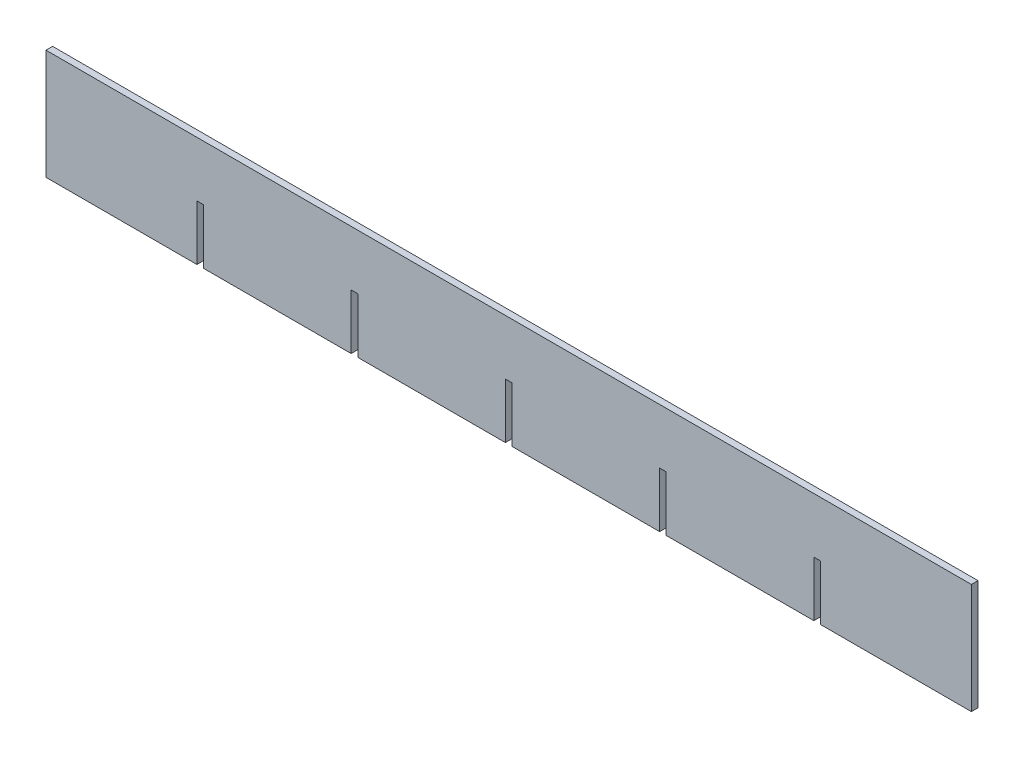
ISO-10303-21;
HEADER;
FILE_DESCRIPTION(('STEP AP214'),'2;1');
FILE_NAME('part.step','',(''),(''),'','','');
FILE_SCHEMA(('AUTOMOTIVE_DESIGN { 1 0 10303 214 1 1 1 1 }'));
ENDSEC;
DATA;
#1=APPLICATION_CONTEXT('core data for automotive mechanical design processes');
#2=APPLICATION_PROTOCOL_DEFINITION('international standard','automotive_design',2000,#1);
#3=PRODUCT_CONTEXT('',#1,'mechanical');
#4=PRODUCT('Part','Part','',(#3));
#5=PRODUCT_RELATED_PRODUCT_CATEGORY('part','',(#4));
#6=PRODUCT_DEFINITION_FORMATION('','',#4);
#7=PRODUCT_DEFINITION_CONTEXT('part definition',#1,'design');
#8=PRODUCT_DEFINITION('design','',#6,#7);
#9=PRODUCT_DEFINITION_SHAPE('','',#8);
#10=(LENGTH_UNIT() NAMED_UNIT(*) SI_UNIT(.MILLI.,.METRE.));
#11=(NAMED_UNIT(*) PLANE_ANGLE_UNIT() SI_UNIT($,.RADIAN.));
#12=(NAMED_UNIT(*) SI_UNIT($,.STERADIAN.) SOLID_ANGLE_UNIT());
#13=UNCERTAINTY_MEASURE_WITH_UNIT(LENGTH_MEASURE(1.E-05),#10,'distance_accuracy_value','');
#14=(GEOMETRIC_REPRESENTATION_CONTEXT(3) GLOBAL_UNCERTAINTY_ASSIGNED_CONTEXT((#13)) GLOBAL_UNIT_ASSIGNED_CONTEXT((#10,
#11,#12)) REPRESENTATION_CONTEXT('',''));
#15=CARTESIAN_POINT('',(0.,0.,0.));
#16=DIRECTION('',(0.,0.,1.));
#17=DIRECTION('',(1.,0.,0.));
#18=AXIS2_PLACEMENT_3D('',#15,#16,#17);
#19=CARTESIAN_POINT('',(351.5,0.,3.));
#20=DIRECTION('',(-1.,0.,0.));
#21=DIRECTION('',(0.,0.,1.));
#22=AXIS2_PLACEMENT_3D('',#19,#20,#21);
#23=PLANE('',#22);
#24=DIRECTION('',(0.,1.,0.));
#25=VECTOR('',#24,1.);
#26=CARTESIAN_POINT('',(351.5,0.,0.));
#27=LINE('',#26,#25);
#28=CARTESIAN_POINT('',(351.5,0.,0.));
#29=VERTEX_POINT('',#28);
#30=CARTESIAN_POINT('',(351.5,25.,0.));
#31=VERTEX_POINT('',#30);
#32=EDGE_CURVE('E232',#29,#31,#27,.T.);
#33=ORIENTED_EDGE('',*,*,#32,.F.);
#34=DIRECTION('',(0.,0.,-1.));
#35=VECTOR('',#34,1.);
#36=CARTESIAN_POINT('',(351.5,0.,3.));
#37=LINE('',#36,#35);
#38=CARTESIAN_POINT('',(351.5,0.,3.));
#39=VERTEX_POINT('',#38);
#40=EDGE_CURVE('E11',#39,#29,#37,.T.);
#41=ORIENTED_EDGE('',*,*,#40,.F.);
#42=DIRECTION('',(0.,1.,0.));
#43=VECTOR('',#42,1.);
#44=CARTESIAN_POINT('',(351.5,0.,3.));
#45=LINE('',#44,#43);
#46=CARTESIAN_POINT('',(351.5,25.,3.));
#47=VERTEX_POINT('',#46);
#48=EDGE_CURVE('E285',#39,#47,#45,.T.);
#49=ORIENTED_EDGE('',*,*,#48,.T.);
#50=DIRECTION('',(0.,0.,-1.));
#51=VECTOR('',#50,1.);
#52=CARTESIAN_POINT('',(351.5,25.,3.));
#53=LINE('',#52,#51);
#54=EDGE_CURVE('E140',#47,#31,#53,.T.);
#55=ORIENTED_EDGE('',*,*,#54,.T.);
#56=EDGE_LOOP('',(#33,#41,#49,#55));
#57=FACE_BOUND('',#56,.T.);
#58=ADVANCED_FACE('F41',(#57),#23,.T.);
#59=CARTESIAN_POINT('',(0.,0.,3.));
#60=DIRECTION('',(0.,1.,0.));
#61=DIRECTION('',(0.,0.,1.));
#62=AXIS2_PLACEMENT_3D('',#59,#60,#61);
#63=PLANE('',#62);
#64=DIRECTION('',(1.,0.,0.));
#65=VECTOR('',#64,1.);
#66=CARTESIAN_POINT('',(0.,0.,0.));
#67=LINE('',#66,#65);
#68=CARTESIAN_POINT('',(420.,0.,0.));
#69=VERTEX_POINT('',#68);
#70=EDGE_CURVE('E235',#29,#69,#67,.T.);
#71=ORIENTED_EDGE('',*,*,#70,.T.);
#72=DIRECTION('',(0.,0.,-1.));
#73=VECTOR('',#72,1.);
#74=CARTESIAN_POINT('',(420.,0.,3.));
#75=LINE('',#74,#73);
#76=CARTESIAN_POINT('',(420.,0.,3.));
#77=VERTEX_POINT('',#76);
#78=EDGE_CURVE('E49',#77,#69,#75,.T.);
#79=ORIENTED_EDGE('',*,*,#78,.F.);
#80=DIRECTION('',(1.,0.,0.));
#81=VECTOR('',#80,1.);
#82=CARTESIAN_POINT('',(0.,0.,3.));
#83=LINE('',#82,#81);
#84=EDGE_CURVE('E218',#39,#77,#83,.T.);
#85=ORIENTED_EDGE('',*,*,#84,.F.);
#86=ORIENTED_EDGE('',*,*,#40,.T.);
#87=EDGE_LOOP('',(#71,#79,#85,#86));
#88=FACE_BOUND('',#87,.T.);
#89=ADVANCED_FACE('F471',(#88),#63,.F.);
#90=CARTESIAN_POINT('',(420.,0.,3.));
#91=DIRECTION('',(-1.,0.,0.));
#92=DIRECTION('',(0.,0.,1.));
#93=AXIS2_PLACEMENT_3D('',#90,#91,#92);
#94=PLANE('',#93);
#95=DIRECTION('',(0.,1.,0.));
#96=VECTOR('',#95,1.);
#97=CARTESIAN_POINT('',(420.,0.,0.));
#98=LINE('',#97,#96);
#99=CARTESIAN_POINT('',(420.,50.,0.));
#100=VERTEX_POINT('',#99);
#101=EDGE_CURVE('E237',#69,#100,#98,.T.);
#102=ORIENTED_EDGE('',*,*,#101,.T.);
#103=DIRECTION('',(0.,0.,-1.));
#104=VECTOR('',#103,1.);
#105=CARTESIAN_POINT('',(420.,50.,3.));
#106=LINE('',#105,#104);
#107=CARTESIAN_POINT('',(420.,50.,3.));
#108=VERTEX_POINT('',#107);
#109=EDGE_CURVE('E331',#108,#100,#106,.T.);
#110=ORIENTED_EDGE('',*,*,#109,.F.);
#111=DIRECTION('',(0.,1.,0.));
#112=VECTOR('',#111,1.);
#113=CARTESIAN_POINT('',(420.,0.,3.));
#114=LINE('',#113,#112);
#115=EDGE_CURVE('E339',#77,#108,#114,.T.);
#116=ORIENTED_EDGE('',*,*,#115,.F.);
#117=ORIENTED_EDGE('',*,*,#78,.T.);
#118=EDGE_LOOP('',(#102,#110,#116,#117));
#119=FACE_BOUND('',#118,.T.);
#120=ADVANCED_FACE('F337',(#119),#94,.F.);
#121=CARTESIAN_POINT('',(0.,50.,3.));
#122=DIRECTION('',(0.,1.,0.));
#123=DIRECTION('',(0.,0.,1.));
#124=AXIS2_PLACEMENT_3D('',#121,#122,#123);
#125=PLANE('',#124);
#126=DIRECTION('',(1.,0.,0.));
#127=VECTOR('',#126,1.);
#128=CARTESIAN_POINT('',(0.,50.,0.));
#129=LINE('',#128,#127);
#130=CARTESIAN_POINT('',(0.,50.,0.));
#131=VERTEX_POINT('',#130);
#132=EDGE_CURVE('E241',#131,#100,#129,.T.);
#133=ORIENTED_EDGE('',*,*,#132,.F.);
#134=DIRECTION('',(0.,0.,-1.));
#135=VECTOR('',#134,1.);
#136=CARTESIAN_POINT('',(0.,50.,3.));
#137=LINE('',#136,#135);
#138=CARTESIAN_POINT('',(0.,50.,3.));
#139=VERTEX_POINT('',#138);
#140=EDGE_CURVE('E329',#139,#131,#137,.T.);
#141=ORIENTED_EDGE('',*,*,#140,.F.);
#142=DIRECTION('',(1.,0.,0.));
#143=VECTOR('',#142,1.);
#144=CARTESIAN_POINT('',(0.,50.,3.));
#145=LINE('',#144,#143);
#146=EDGE_CURVE('E351',#139,#108,#145,.T.);
#147=ORIENTED_EDGE('',*,*,#146,.T.);
#148=ORIENTED_EDGE('',*,*,#109,.T.);
#149=EDGE_LOOP('',(#133,#141,#147,#148));
#150=FACE_BOUND('',#149,.T.);
#151=ADVANCED_FACE('F348',(#150),#125,.T.);
#152=CARTESIAN_POINT('',(0.,0.,3.));
#153=DIRECTION('',(-1.,0.,0.));
#154=DIRECTION('',(0.,0.,1.));
#155=AXIS2_PLACEMENT_3D('',#152,#153,#154);
#156=PLANE('',#155);
#157=DIRECTION('',(0.,1.,0.));
#158=VECTOR('',#157,1.);
#159=CARTESIAN_POINT('',(0.,0.,0.));
#160=LINE('',#159,#158);
#161=CARTESIAN_POINT('',(0.,0.,0.));
#162=VERTEX_POINT('',#161);
#163=EDGE_CURVE('E244',#162,#131,#160,.T.);
#164=ORIENTED_EDGE('',*,*,#163,.F.);
#165=DIRECTION('',(0.,0.,-1.));
#166=VECTOR('',#165,1.);
#167=CARTESIAN_POINT('',(0.,0.,3.));
#168=LINE('',#167,#166);
#169=CARTESIAN_POINT('',(0.,0.,3.));
#170=VERTEX_POINT('',#169);
#171=EDGE_CURVE('E327',#170,#162,#168,.T.);
#172=ORIENTED_EDGE('',*,*,#171,.F.);
#173=DIRECTION('',(0.,1.,0.));
#174=VECTOR('',#173,1.);
#175=CARTESIAN_POINT('',(0.,0.,3.));
#176=LINE('',#175,#174);
#177=EDGE_CURVE('E354',#170,#139,#176,.T.);
#178=ORIENTED_EDGE('',*,*,#177,.T.);
#179=ORIENTED_EDGE('',*,*,#140,.T.);
#180=EDGE_LOOP('',(#164,#172,#178,#179));
#181=FACE_BOUND('',#180,.T.);
#182=ADVANCED_FACE('F706',(#181),#156,.T.);
#183=CARTESIAN_POINT('',(68.5,0.,0.));
#184=VERTEX_POINT('',#183);
#185=EDGE_CURVE('E238',#162,#184,#67,.T.);
#186=ORIENTED_EDGE('',*,*,#185,.T.);
#187=DIRECTION('',(0.,0.,-1.));
#188=VECTOR('',#187,1.);
#189=CARTESIAN_POINT('',(68.5,0.,3.));
#190=LINE('',#189,#188);
#191=CARTESIAN_POINT('',(68.5,0.,3.));
#192=VERTEX_POINT('',#191);
#193=EDGE_CURVE('E324',#192,#184,#190,.T.);
#194=ORIENTED_EDGE('',*,*,#193,.F.);
#195=EDGE_CURVE('E356',#170,#192,#83,.T.);
#196=ORIENTED_EDGE('',*,*,#195,.F.);
#197=ORIENTED_EDGE('',*,*,#171,.T.);
#198=EDGE_LOOP('',(#186,#194,#196,#197));
#199=FACE_BOUND('',#198,.T.);
#200=ADVANCED_FACE('F403',(#199),#63,.F.);
#201=CARTESIAN_POINT('',(68.5,0.,3.));
#202=DIRECTION('',(-1.,0.,0.));
#203=DIRECTION('',(0.,0.,1.));
#204=AXIS2_PLACEMENT_3D('',#201,#202,#203);
#205=PLANE('',#204);
#206=DIRECTION('',(0.,1.,0.));
#207=VECTOR('',#206,1.);
#208=CARTESIAN_POINT('',(68.5,0.,0.));
#209=LINE('',#208,#207);
#210=CARTESIAN_POINT('',(68.5,25.,0.));
#211=VERTEX_POINT('',#210);
#212=EDGE_CURVE('E247',#184,#211,#209,.T.);
#213=ORIENTED_EDGE('',*,*,#212,.T.);
#214=DIRECTION('',(0.,0.,-1.));
#215=VECTOR('',#214,1.);
#216=CARTESIAN_POINT('',(68.5,25.,3.));
#217=LINE('',#216,#215);
#218=CARTESIAN_POINT('',(68.5,25.,3.));
#219=VERTEX_POINT('',#218);
#220=EDGE_CURVE('E321',#219,#211,#217,.T.);
#221=ORIENTED_EDGE('',*,*,#220,.F.);
#222=DIRECTION('',(0.,1.,0.));
#223=VECTOR('',#222,1.);
#224=CARTESIAN_POINT('',(68.5,0.,3.));
#225=LINE('',#224,#223);
#226=EDGE_CURVE('E360',#192,#219,#225,.T.);
#227=ORIENTED_EDGE('',*,*,#226,.F.);
#228=ORIENTED_EDGE('',*,*,#193,.T.);
#229=EDGE_LOOP('',(#213,#221,#227,#228));
#230=FACE_BOUND('',#229,.T.);
#231=ADVANCED_FACE('F408',(#230),#205,.F.);
#232=CARTESIAN_POINT('',(0.,25.,3.));
#233=DIRECTION('',(0.,1.,0.));
#234=DIRECTION('',(0.,0.,1.));
#235=AXIS2_PLACEMENT_3D('',#232,#233,#234);
#236=PLANE('',#235);
#237=DIRECTION('',(1.,0.,0.));
#238=VECTOR('',#237,1.);
#239=CARTESIAN_POINT('',(0.,25.,0.));
#240=LINE('',#239,#238);
#241=CARTESIAN_POINT('',(71.5,25.,0.));
#242=VERTEX_POINT('',#241);
#243=EDGE_CURVE('E249',#211,#242,#240,.T.);
#244=ORIENTED_EDGE('',*,*,#243,.T.);
#245=DIRECTION('',(0.,0.,-1.));
#246=VECTOR('',#245,1.);
#247=CARTESIAN_POINT('',(71.5,25.,3.));
#248=LINE('',#247,#246);
#249=CARTESIAN_POINT('',(71.5,25.,3.));
#250=VERTEX_POINT('',#249);
#251=EDGE_CURVE('E319',#250,#242,#248,.T.);
#252=ORIENTED_EDGE('',*,*,#251,.F.);
#253=DIRECTION('',(1.,0.,0.));
#254=VECTOR('',#253,1.);
#255=CARTESIAN_POINT('',(0.,25.,3.));
#256=LINE('',#255,#254);
#257=EDGE_CURVE('E362',#219,#250,#256,.T.);
#258=ORIENTED_EDGE('',*,*,#257,.F.);
#259=ORIENTED_EDGE('',*,*,#220,.T.);
#260=EDGE_LOOP('',(#244,#252,#258,#259));
#261=FACE_BOUND('',#260,.T.);
#262=ADVANCED_FACE('F414',(#261),#236,.F.);
#263=CARTESIAN_POINT('',(71.5,0.,3.));
#264=DIRECTION('',(-1.,0.,0.));
#265=DIRECTION('',(0.,-1.,0.));
#266=AXIS2_PLACEMENT_3D('',#263,#264,#265);
#267=PLANE('',#266);
#268=DIRECTION('',(0.,1.,0.));
#269=VECTOR('',#268,1.);
#270=CARTESIAN_POINT('',(71.5,0.,0.));
#271=LINE('',#270,#269);
#272=CARTESIAN_POINT('',(71.5,0.,0.));
#273=VERTEX_POINT('',#272);
#274=EDGE_CURVE('E252',#273,#242,#271,.T.);
#275=ORIENTED_EDGE('',*,*,#274,.F.);
#276=DIRECTION('',(0.,0.,-1.));
#277=VECTOR('',#276,1.);
#278=CARTESIAN_POINT('',(71.5,0.,3.));
#279=LINE('',#278,#277);
#280=CARTESIAN_POINT('',(71.5,0.,3.));
#281=VERTEX_POINT('',#280);
#282=EDGE_CURVE('E317',#281,#273,#279,.T.);
#283=ORIENTED_EDGE('',*,*,#282,.F.);
#284=DIRECTION('',(0.,1.,0.));
#285=VECTOR('',#284,1.);
#286=CARTESIAN_POINT('',(71.5,0.,3.));
#287=LINE('',#286,#285);
#288=EDGE_CURVE('E364',#281,#250,#287,.T.);
#289=ORIENTED_EDGE('',*,*,#288,.T.);
#290=ORIENTED_EDGE('',*,*,#251,.T.);
#291=EDGE_LOOP('',(#275,#283,#289,#290));
#292=FACE_BOUND('',#291,.T.);
#293=ADVANCED_FACE('F460',(#292),#267,.T.);
#294=CARTESIAN_POINT('',(138.5,0.,0.));
#295=VERTEX_POINT('',#294);
#296=EDGE_CURVE('E255',#273,#295,#67,.T.);
#297=ORIENTED_EDGE('',*,*,#296,.T.);
#298=DIRECTION('',(0.,0.,-1.));
#299=VECTOR('',#298,1.);
#300=CARTESIAN_POINT('',(138.5,0.,3.));
#301=LINE('',#300,#299);
#302=CARTESIAN_POINT('',(138.5,0.,3.));
#303=VERTEX_POINT('',#302);
#304=EDGE_CURVE('E314',#303,#295,#301,.T.);
#305=ORIENTED_EDGE('',*,*,#304,.F.);
#306=EDGE_CURVE('E367',#281,#303,#83,.T.);
#307=ORIENTED_EDGE('',*,*,#306,.F.);
#308=ORIENTED_EDGE('',*,*,#282,.T.);
#309=EDGE_LOOP('',(#297,#305,#307,#308));
#310=FACE_BOUND('',#309,.T.);
#311=ADVANCED_FACE('F458',(#310),#63,.F.);
#312=CARTESIAN_POINT('',(138.5,0.,3.));
#313=DIRECTION('',(-1.,0.,0.));
#314=DIRECTION('',(0.,0.,1.));
#315=AXIS2_PLACEMENT_3D('',#312,#313,#314);
#316=PLANE('',#315);
#317=DIRECTION('',(0.,1.,0.));
#318=VECTOR('',#317,1.);
#319=CARTESIAN_POINT('',(138.5,0.,0.));
#320=LINE('',#319,#318);
#321=CARTESIAN_POINT('',(138.5,25.,0.));
#322=VERTEX_POINT('',#321);
#323=EDGE_CURVE('E256',#295,#322,#320,.T.);
#324=ORIENTED_EDGE('',*,*,#323,.T.);
#325=DIRECTION('',(0.,0.,-1.));
#326=VECTOR('',#325,1.);
#327=CARTESIAN_POINT('',(138.5,25.,3.));
#328=LINE('',#327,#326);
#329=CARTESIAN_POINT('',(138.5,25.,3.));
#330=VERTEX_POINT('',#329);
#331=EDGE_CURVE('E311',#330,#322,#328,.T.);
#332=ORIENTED_EDGE('',*,*,#331,.F.);
#333=DIRECTION('',(0.,1.,0.));
#334=VECTOR('',#333,1.);
#335=CARTESIAN_POINT('',(138.5,0.,3.));
#336=LINE('',#335,#334);
#337=EDGE_CURVE('E368',#303,#330,#336,.T.);
#338=ORIENTED_EDGE('',*,*,#337,.F.);
#339=ORIENTED_EDGE('',*,*,#304,.T.);
#340=EDGE_LOOP('',(#324,#332,#338,#339));
#341=FACE_BOUND('',#340,.T.);
#342=ADVANCED_FACE('F457',(#341),#316,.F.);
#343=CARTESIAN_POINT('',(0.,25.,3.));
#344=DIRECTION('',(0.,1.,0.));
#345=DIRECTION('',(0.,0.,1.));
#346=AXIS2_PLACEMENT_3D('',#343,#344,#345);
#347=PLANE('',#346);
#348=DIRECTION('',(1.,0.,0.));
#349=VECTOR('',#348,1.);
#350=CARTESIAN_POINT('',(0.,25.,0.));
#351=LINE('',#350,#349);
#352=CARTESIAN_POINT('',(141.5,25.,0.));
#353=VERTEX_POINT('',#352);
#354=EDGE_CURVE('E258',#322,#353,#351,.T.);
#355=ORIENTED_EDGE('',*,*,#354,.T.);
#356=DIRECTION('',(0.,0.,-1.));
#357=VECTOR('',#356,1.);
#358=CARTESIAN_POINT('',(141.5,25.,3.));
#359=LINE('',#358,#357);
#360=CARTESIAN_POINT('',(141.5,25.,3.));
#361=VERTEX_POINT('',#360);
#362=EDGE_CURVE('E309',#361,#353,#359,.T.);
#363=ORIENTED_EDGE('',*,*,#362,.F.);
#364=DIRECTION('',(1.,0.,0.));
#365=VECTOR('',#364,1.);
#366=CARTESIAN_POINT('',(0.,25.,3.));
#367=LINE('',#366,#365);
#368=EDGE_CURVE('E370',#330,#361,#367,.T.);
#369=ORIENTED_EDGE('',*,*,#368,.F.);
#370=ORIENTED_EDGE('',*,*,#331,.T.);
#371=EDGE_LOOP('',(#355,#363,#369,#370));
#372=FACE_BOUND('',#371,.T.);
#373=ADVANCED_FACE('F453',(#372),#347,.F.);
#374=CARTESIAN_POINT('',(141.5,0.,3.));
#375=DIRECTION('',(-1.,0.,0.));
#376=DIRECTION('',(0.,0.,1.));
#377=AXIS2_PLACEMENT_3D('',#374,#375,#376);
#378=PLANE('',#377);
#379=DIRECTION('',(0.,1.,0.));
#380=VECTOR('',#379,1.);
#381=CARTESIAN_POINT('',(141.5,0.,0.));
#382=LINE('',#381,#380);
#383=CARTESIAN_POINT('',(141.5,0.,0.));
#384=VERTEX_POINT('',#383);
#385=EDGE_CURVE('E261',#384,#353,#382,.T.);
#386=ORIENTED_EDGE('',*,*,#385,.F.);
#387=DIRECTION('',(0.,0.,-1.));
#388=VECTOR('',#387,1.);
#389=CARTESIAN_POINT('',(141.5,0.,3.));
#390=LINE('',#389,#388);
#391=CARTESIAN_POINT('',(141.5,0.,3.));
#392=VERTEX_POINT('',#391);
#393=EDGE_CURVE('E307',#392,#384,#390,.T.);
#394=ORIENTED_EDGE('',*,*,#393,.F.);
#395=DIRECTION('',(0.,1.,0.));
#396=VECTOR('',#395,1.);
#397=CARTESIAN_POINT('',(141.5,0.,3.));
#398=LINE('',#397,#396);
#399=EDGE_CURVE('E372',#392,#361,#398,.T.);
#400=ORIENTED_EDGE('',*,*,#399,.T.);
#401=ORIENTED_EDGE('',*,*,#362,.T.);
#402=EDGE_LOOP('',(#386,#394,#400,#401));
#403=FACE_BOUND('',#402,.T.);
#404=ADVANCED_FACE('F449',(#403),#378,.T.);
#405=CARTESIAN_POINT('',(208.5,0.,0.));
#406=VERTEX_POINT('',#405);
#407=EDGE_CURVE('E264',#384,#406,#67,.T.);
#408=ORIENTED_EDGE('',*,*,#407,.T.);
#409=DIRECTION('',(0.,0.,-1.));
#410=VECTOR('',#409,1.);
#411=CARTESIAN_POINT('',(208.5,0.,3.));
#412=LINE('',#411,#410);
#413=CARTESIAN_POINT('',(208.5,0.,3.));
#414=VERTEX_POINT('',#413);
#415=EDGE_CURVE('E304',#414,#406,#412,.T.);
#416=ORIENTED_EDGE('',*,*,#415,.F.);
#417=EDGE_CURVE('E375',#392,#414,#83,.T.);
#418=ORIENTED_EDGE('',*,*,#417,.F.);
#419=ORIENTED_EDGE('',*,*,#393,.T.);
#420=EDGE_LOOP('',(#408,#416,#418,#419));
#421=FACE_BOUND('',#420,.T.);
#422=ADVANCED_FACE('F445',(#421),#63,.F.);
#423=CARTESIAN_POINT('',(208.5,0.,3.));
#424=DIRECTION('',(-1.,0.,0.));
#425=DIRECTION('',(0.,0.,1.));
#426=AXIS2_PLACEMENT_3D('',#423,#424,#425);
#427=PLANE('',#426);
#428=DIRECTION('',(0.,1.,0.));
#429=VECTOR('',#428,1.);
#430=CARTESIAN_POINT('',(208.5,0.,0.));
#431=LINE('',#430,#429);
#432=CARTESIAN_POINT('',(208.5,25.,0.));
#433=VERTEX_POINT('',#432);
#434=EDGE_CURVE('E265',#406,#433,#431,.T.);
#435=ORIENTED_EDGE('',*,*,#434,.T.);
#436=DIRECTION('',(0.,0.,-1.));
#437=VECTOR('',#436,1.);
#438=CARTESIAN_POINT('',(208.5,25.,3.));
#439=LINE('',#438,#437);
#440=CARTESIAN_POINT('',(208.5,25.,3.));
#441=VERTEX_POINT('',#440);
#442=EDGE_CURVE('E301',#441,#433,#439,.T.);
#443=ORIENTED_EDGE('',*,*,#442,.F.);
#444=DIRECTION('',(0.,1.,0.));
#445=VECTOR('',#444,1.);
#446=CARTESIAN_POINT('',(208.5,0.,3.));
#447=LINE('',#446,#445);
#448=EDGE_CURVE('E376',#414,#441,#447,.T.);
#449=ORIENTED_EDGE('',*,*,#448,.F.);
#450=ORIENTED_EDGE('',*,*,#415,.T.);
#451=EDGE_LOOP('',(#435,#443,#449,#450));
#452=FACE_BOUND('',#451,.T.);
#453=ADVANCED_FACE('F443',(#452),#427,.F.);
#454=CARTESIAN_POINT('',(0.,25.,3.));
#455=DIRECTION('',(0.,1.,0.));
#456=DIRECTION('',(0.,0.,1.));
#457=AXIS2_PLACEMENT_3D('',#454,#455,#456);
#458=PLANE('',#457);
#459=DIRECTION('',(1.,0.,0.));
#460=VECTOR('',#459,1.);
#461=CARTESIAN_POINT('',(0.,25.,0.));
#462=LINE('',#461,#460);
#463=CARTESIAN_POINT('',(211.5,25.,0.));
#464=VERTEX_POINT('',#463);
#465=EDGE_CURVE('E267',#433,#464,#462,.T.);
#466=ORIENTED_EDGE('',*,*,#465,.T.);
#467=DIRECTION('',(0.,0.,-1.));
#468=VECTOR('',#467,1.);
#469=CARTESIAN_POINT('',(211.5,25.,3.));
#470=LINE('',#469,#468);
#471=CARTESIAN_POINT('',(211.5,25.,3.));
#472=VERTEX_POINT('',#471);
#473=EDGE_CURVE('E299',#472,#464,#470,.T.);
#474=ORIENTED_EDGE('',*,*,#473,.F.);
#475=DIRECTION('',(1.,0.,0.));
#476=VECTOR('',#475,1.);
#477=CARTESIAN_POINT('',(0.,25.,3.));
#478=LINE('',#477,#476);
#479=EDGE_CURVE('E378',#441,#472,#478,.T.);
#480=ORIENTED_EDGE('',*,*,#479,.F.);
#481=ORIENTED_EDGE('',*,*,#442,.T.);
#482=EDGE_LOOP('',(#466,#474,#480,#481));
#483=FACE_BOUND('',#482,.T.);
#484=ADVANCED_FACE('F438',(#483),#458,.F.);
#485=CARTESIAN_POINT('',(211.5,0.,3.));
#486=DIRECTION('',(-1.,0.,0.));
#487=DIRECTION('',(0.,0.,1.));
#488=AXIS2_PLACEMENT_3D('',#485,#486,#487);
#489=PLANE('',#488);
#490=DIRECTION('',(0.,1.,0.));
#491=VECTOR('',#490,1.);
#492=CARTESIAN_POINT('',(211.5,0.,0.));
#493=LINE('',#492,#491);
#494=CARTESIAN_POINT('',(211.5,0.,0.));
#495=VERTEX_POINT('',#494);
#496=EDGE_CURVE('E270',#495,#464,#493,.T.);
#497=ORIENTED_EDGE('',*,*,#496,.F.);
#498=DIRECTION('',(0.,0.,-1.));
#499=VECTOR('',#498,1.);
#500=CARTESIAN_POINT('',(211.5,0.,3.));
#501=LINE('',#500,#499);
#502=CARTESIAN_POINT('',(211.5,0.,3.));
#503=VERTEX_POINT('',#502);
#504=EDGE_CURVE('E297',#503,#495,#501,.T.);
#505=ORIENTED_EDGE('',*,*,#504,.F.);
#506=DIRECTION('',(0.,1.,0.));
#507=VECTOR('',#506,1.);
#508=CARTESIAN_POINT('',(211.5,0.,3.));
#509=LINE('',#508,#507);
#510=EDGE_CURVE('E380',#503,#472,#509,.T.);
#511=ORIENTED_EDGE('',*,*,#510,.T.);
#512=ORIENTED_EDGE('',*,*,#473,.T.);
#513=EDGE_LOOP('',(#497,#505,#511,#512));
#514=FACE_BOUND('',#513,.T.);
#515=ADVANCED_FACE('F434',(#514),#489,.T.);
#516=CARTESIAN_POINT('',(278.5,0.,0.));
#517=VERTEX_POINT('',#516);
#518=EDGE_CURVE('E273',#495,#517,#67,.T.);
#519=ORIENTED_EDGE('',*,*,#518,.T.);
#520=DIRECTION('',(0.,0.,-1.));
#521=VECTOR('',#520,1.);
#522=CARTESIAN_POINT('',(278.5,0.,3.));
#523=LINE('',#522,#521);
#524=CARTESIAN_POINT('',(278.5,0.,3.));
#525=VERTEX_POINT('',#524);
#526=EDGE_CURVE('E294',#525,#517,#523,.T.);
#527=ORIENTED_EDGE('',*,*,#526,.F.);
#528=EDGE_CURVE('E217',#503,#525,#83,.T.);
#529=ORIENTED_EDGE('',*,*,#528,.F.);
#530=ORIENTED_EDGE('',*,*,#504,.T.);
#531=EDGE_LOOP('',(#519,#527,#529,#530));
#532=FACE_BOUND('',#531,.T.);
#533=ADVANCED_FACE('F425',(#532),#63,.F.);
#534=CARTESIAN_POINT('',(278.5,0.,3.));
#535=DIRECTION('',(-1.,0.,0.));
#536=DIRECTION('',(0.,0.,1.));
#537=AXIS2_PLACEMENT_3D('',#534,#535,#536);
#538=PLANE('',#537);
#539=DIRECTION('',(0.,1.,0.));
#540=VECTOR('',#539,1.);
#541=CARTESIAN_POINT('',(278.5,0.,0.));
#542=LINE('',#541,#540);
#543=CARTESIAN_POINT('',(278.5,25.,0.));
#544=VERTEX_POINT('',#543);
#545=EDGE_CURVE('E274',#517,#544,#542,.T.);
#546=ORIENTED_EDGE('',*,*,#545,.T.);
#547=DIRECTION('',(0.,0.,-1.));
#548=VECTOR('',#547,1.);
#549=CARTESIAN_POINT('',(278.5,25.,3.));
#550=LINE('',#549,#548);
#551=CARTESIAN_POINT('',(278.5,25.,3.));
#552=VERTEX_POINT('',#551);
#553=EDGE_CURVE('E291',#552,#544,#550,.T.);
#554=ORIENTED_EDGE('',*,*,#553,.F.);
#555=DIRECTION('',(0.,1.,0.));
#556=VECTOR('',#555,1.);
#557=CARTESIAN_POINT('',(278.5,0.,3.));
#558=LINE('',#557,#556);
#559=EDGE_CURVE('E383',#525,#552,#558,.T.);
#560=ORIENTED_EDGE('',*,*,#559,.F.);
#561=ORIENTED_EDGE('',*,*,#526,.T.);
#562=EDGE_LOOP('',(#546,#554,#560,#561));
#563=FACE_BOUND('',#562,.T.);
#564=ADVANCED_FACE('F428',(#563),#538,.F.);
#565=CARTESIAN_POINT('',(0.,25.,3.));
#566=DIRECTION('',(0.,1.,0.));
#567=DIRECTION('',(0.,0.,1.));
#568=AXIS2_PLACEMENT_3D('',#565,#566,#567);
#569=PLANE('',#568);
#570=DIRECTION('',(1.,0.,0.));
#571=VECTOR('',#570,1.);
#572=CARTESIAN_POINT('',(0.,25.,0.));
#573=LINE('',#572,#571);
#574=CARTESIAN_POINT('',(281.5,25.,0.));
#575=VERTEX_POINT('',#574);
#576=EDGE_CURVE('E276',#544,#575,#573,.T.);
#577=ORIENTED_EDGE('',*,*,#576,.T.);
#578=DIRECTION('',(0.,0.,-1.));
#579=VECTOR('',#578,1.);
#580=CARTESIAN_POINT('',(281.5,25.,3.));
#581=LINE('',#580,#579);
#582=CARTESIAN_POINT('',(281.5,25.,3.));
#583=VERTEX_POINT('',#582);
#584=EDGE_CURVE('E289',#583,#575,#581,.T.);
#585=ORIENTED_EDGE('',*,*,#584,.F.);
#586=DIRECTION('',(1.,0.,0.));
#587=VECTOR('',#586,1.);
#588=CARTESIAN_POINT('',(0.,25.,3.));
#589=LINE('',#588,#587);
#590=EDGE_CURVE('E384',#552,#583,#589,.T.);
#591=ORIENTED_EDGE('',*,*,#590,.F.);
#592=ORIENTED_EDGE('',*,*,#553,.T.);
#593=EDGE_LOOP('',(#577,#585,#591,#592));
#594=FACE_BOUND('',#593,.T.);
#595=ADVANCED_FACE('F430',(#594),#569,.F.);
#596=CARTESIAN_POINT('',(281.5,0.,3.));
#597=DIRECTION('',(-1.,0.,0.));
#598=DIRECTION('',(0.,0.,1.));
#599=AXIS2_PLACEMENT_3D('',#596,#597,#598);
#600=PLANE('',#599);
#601=DIRECTION('',(0.,1.,0.));
#602=VECTOR('',#601,1.);
#603=CARTESIAN_POINT('',(281.5,0.,0.));
#604=LINE('',#603,#602);
#605=CARTESIAN_POINT('',(281.5,0.,0.));
#606=VERTEX_POINT('',#605);
#607=EDGE_CURVE('E279',#606,#575,#604,.T.);
#608=ORIENTED_EDGE('',*,*,#607,.F.);
#609=DIRECTION('',(0.,0.,-1.));
#610=VECTOR('',#609,1.);
#611=CARTESIAN_POINT('',(281.5,0.,3.));
#612=LINE('',#611,#610);
#613=CARTESIAN_POINT('',(281.5,0.,3.));
#614=VERTEX_POINT('',#613);
#615=EDGE_CURVE('E223',#614,#606,#612,.T.);
#616=ORIENTED_EDGE('',*,*,#615,.F.);
#617=DIRECTION('',(0.,1.,0.));
#618=VECTOR('',#617,1.);
#619=CARTESIAN_POINT('',(281.5,0.,3.));
#620=LINE('',#619,#618);
#621=EDGE_CURVE('E214',#614,#583,#620,.T.);
#622=ORIENTED_EDGE('',*,*,#621,.T.);
#623=ORIENTED_EDGE('',*,*,#584,.T.);
#624=EDGE_LOOP('',(#608,#616,#622,#623));
#625=FACE_BOUND('',#624,.T.);
#626=ADVANCED_FACE('F389',(#625),#600,.T.);
#627=CARTESIAN_POINT('',(348.5,0.,0.));
#628=VERTEX_POINT('',#627);
#629=EDGE_CURVE('E222',#606,#628,#67,.T.);
#630=ORIENTED_EDGE('',*,*,#629,.T.);
#631=DIRECTION('',(0.,0.,-1.));
#632=VECTOR('',#631,1.);
#633=CARTESIAN_POINT('',(348.5,0.,3.));
#634=LINE('',#633,#632);
#635=CARTESIAN_POINT('',(348.5,0.,3.));
#636=VERTEX_POINT('',#635);
#637=EDGE_CURVE('E219',#636,#628,#634,.T.);
#638=ORIENTED_EDGE('',*,*,#637,.F.);
#639=EDGE_CURVE('E208',#614,#636,#83,.T.);
#640=ORIENTED_EDGE('',*,*,#639,.F.);
#641=ORIENTED_EDGE('',*,*,#615,.T.);
#642=EDGE_LOOP('',(#630,#638,#640,#641));
#643=FACE_BOUND('',#642,.T.);
#644=ADVANCED_FACE('F220',(#643),#63,.F.);
#645=CARTESIAN_POINT('',(348.5,0.,3.));
#646=DIRECTION('',(-1.,0.,0.));
#647=DIRECTION('',(0.,0.,1.));
#648=AXIS2_PLACEMENT_3D('',#645,#646,#647);
#649=PLANE('',#648);
#650=DIRECTION('',(0.,1.,0.));
#651=VECTOR('',#650,1.);
#652=CARTESIAN_POINT('',(348.5,0.,0.));
#653=LINE('',#652,#651);
#654=CARTESIAN_POINT('',(348.5,25.,0.));
#655=VERTEX_POINT('',#654);
#656=EDGE_CURVE('E133',#628,#655,#653,.T.);
#657=ORIENTED_EDGE('',*,*,#656,.T.);
#658=DIRECTION('',(0.,0.,-1.));
#659=VECTOR('',#658,1.);
#660=CARTESIAN_POINT('',(348.5,25.,3.));
#661=LINE('',#660,#659);
#662=CARTESIAN_POINT('',(348.5,25.,3.));
#663=VERTEX_POINT('',#662);
#664=EDGE_CURVE('E224',#663,#655,#661,.T.);
#665=ORIENTED_EDGE('',*,*,#664,.F.);
#666=DIRECTION('',(0.,1.,0.));
#667=VECTOR('',#666,1.);
#668=CARTESIAN_POINT('',(348.5,0.,3.));
#669=LINE('',#668,#667);
#670=EDGE_CURVE('E212',#636,#663,#669,.T.);
#671=ORIENTED_EDGE('',*,*,#670,.F.);
#672=ORIENTED_EDGE('',*,*,#637,.T.);
#673=EDGE_LOOP('',(#657,#665,#671,#672));
#674=FACE_BOUND('',#673,.T.);
#675=ADVANCED_FACE('F226',(#674),#649,.F.);
#676=CARTESIAN_POINT('',(0.,25.,3.));
#677=DIRECTION('',(0.,1.,0.));
#678=DIRECTION('',(0.,0.,1.));
#679=AXIS2_PLACEMENT_3D('',#676,#677,#678);
#680=PLANE('',#679);
#681=DIRECTION('',(1.,0.,0.));
#682=VECTOR('',#681,1.);
#683=CARTESIAN_POINT('',(0.,25.,0.));
#684=LINE('',#683,#682);
#685=EDGE_CURVE('E283',#655,#31,#684,.T.);
#686=ORIENTED_EDGE('',*,*,#685,.T.);
#687=ORIENTED_EDGE('',*,*,#54,.F.);
#688=DIRECTION('',(1.,0.,0.));
#689=VECTOR('',#688,1.);
#690=CARTESIAN_POINT('',(0.,25.,3.));
#691=LINE('',#690,#689);
#692=EDGE_CURVE('E57',#663,#47,#691,.T.);
#693=ORIENTED_EDGE('',*,*,#692,.F.);
#694=ORIENTED_EDGE('',*,*,#664,.T.);
#695=EDGE_LOOP('',(#686,#687,#693,#694));
#696=FACE_BOUND('',#695,.T.);
#697=ADVANCED_FACE('F476',(#696),#680,.F.);
#698=CARTESIAN_POINT('',(0.,0.,3.));
#699=DIRECTION('',(0.,0.,1.));
#700=DIRECTION('',(1.,0.,0.));
#701=AXIS2_PLACEMENT_3D('',#698,#699,#700);
#702=PLANE('',#701);
#703=ORIENTED_EDGE('',*,*,#48,.F.);
#704=ORIENTED_EDGE('',*,*,#84,.T.);
#705=ORIENTED_EDGE('',*,*,#115,.T.);
#706=ORIENTED_EDGE('',*,*,#146,.F.);
#707=ORIENTED_EDGE('',*,*,#177,.F.);
#708=ORIENTED_EDGE('',*,*,#195,.T.);
#709=ORIENTED_EDGE('',*,*,#226,.T.);
#710=ORIENTED_EDGE('',*,*,#257,.T.);
#711=ORIENTED_EDGE('',*,*,#288,.F.);
#712=ORIENTED_EDGE('',*,*,#306,.T.);
#713=ORIENTED_EDGE('',*,*,#337,.T.);
#714=ORIENTED_EDGE('',*,*,#368,.T.);
#715=ORIENTED_EDGE('',*,*,#399,.F.);
#716=ORIENTED_EDGE('',*,*,#417,.T.);
#717=ORIENTED_EDGE('',*,*,#448,.T.);
#718=ORIENTED_EDGE('',*,*,#479,.T.);
#719=ORIENTED_EDGE('',*,*,#510,.F.);
#720=ORIENTED_EDGE('',*,*,#528,.T.);
#721=ORIENTED_EDGE('',*,*,#559,.T.);
#722=ORIENTED_EDGE('',*,*,#590,.T.);
#723=ORIENTED_EDGE('',*,*,#621,.F.);
#724=ORIENTED_EDGE('',*,*,#639,.T.);
#725=ORIENTED_EDGE('',*,*,#670,.T.);
#726=ORIENTED_EDGE('',*,*,#692,.T.);
#727=EDGE_LOOP('',(#703,#704,#705,#706,#707,#708,#709,#710,#711,#712,#713,#714,#715,#716,#717,
#718,#719,#720,#721,#722,#723,#724,#725,#726));
#728=FACE_BOUND('',#727,.T.);
#729=ADVANCED_FACE('F210',(#728),#702,.T.);
#730=CARTESIAN_POINT('',(0.,0.,0.));
#731=DIRECTION('',(0.,0.,1.));
#732=DIRECTION('',(1.,0.,0.));
#733=AXIS2_PLACEMENT_3D('',#730,#731,#732);
#734=PLANE('',#733);
#735=ORIENTED_EDGE('',*,*,#32,.T.);
#736=ORIENTED_EDGE('',*,*,#685,.F.);
#737=ORIENTED_EDGE('',*,*,#656,.F.);
#738=ORIENTED_EDGE('',*,*,#629,.F.);
#739=ORIENTED_EDGE('',*,*,#607,.T.);
#740=ORIENTED_EDGE('',*,*,#576,.F.);
#741=ORIENTED_EDGE('',*,*,#545,.F.);
#742=ORIENTED_EDGE('',*,*,#518,.F.);
#743=ORIENTED_EDGE('',*,*,#496,.T.);
#744=ORIENTED_EDGE('',*,*,#465,.F.);
#745=ORIENTED_EDGE('',*,*,#434,.F.);
#746=ORIENTED_EDGE('',*,*,#407,.F.);
#747=ORIENTED_EDGE('',*,*,#385,.T.);
#748=ORIENTED_EDGE('',*,*,#354,.F.);
#749=ORIENTED_EDGE('',*,*,#323,.F.);
#750=ORIENTED_EDGE('',*,*,#296,.F.);
#751=ORIENTED_EDGE('',*,*,#274,.T.);
#752=ORIENTED_EDGE('',*,*,#243,.F.);
#753=ORIENTED_EDGE('',*,*,#212,.F.);
#754=ORIENTED_EDGE('',*,*,#185,.F.);
#755=ORIENTED_EDGE('',*,*,#163,.T.);
#756=ORIENTED_EDGE('',*,*,#132,.T.);
#757=ORIENTED_EDGE('',*,*,#101,.F.);
#758=ORIENTED_EDGE('',*,*,#70,.F.);
#759=EDGE_LOOP('',(#735,#736,#737,#738,#739,#740,#741,#742,#743,#744,#745,#746,#747,#748,#749,
#750,#751,#752,#753,#754,#755,#756,#757,#758));
#760=FACE_BOUND('',#759,.T.);
#761=ADVANCED_FACE('F343',(#760),#734,.F.);
#762=CLOSED_SHELL('',(#58,#89,#120,#151,#182,#200,#231,#262,#293,#311,#342,#373,#404,#422,#453,
#484,#515,#533,#564,#595,#626,#644,#675,#697,#729,#761));
#763=MANIFOLD_SOLID_BREP('B2',#762);
#764=ADVANCED_BREP_SHAPE_REPRESENTATION('',(#18,#763),#14);
#765=SHAPE_DEFINITION_REPRESENTATION(#9,#764);
ENDSEC;
END-ISO-10303-21;
